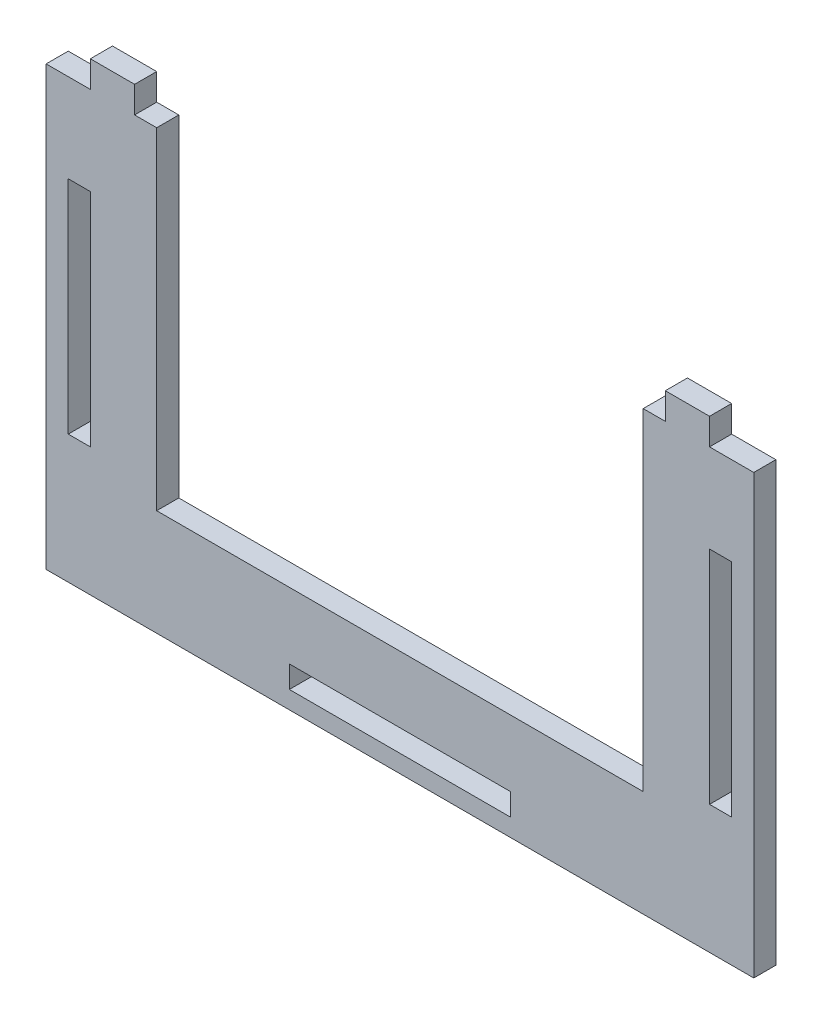
ISO-10303-21;
HEADER;
FILE_DESCRIPTION(('STEP AP214'),'2;1');
FILE_NAME('part.step','',(''),(''),'','','');
FILE_SCHEMA(('AUTOMOTIVE_DESIGN { 1 0 10303 214 1 1 1 1 }'));
ENDSEC;
DATA;
#1=APPLICATION_CONTEXT('core data for automotive mechanical design processes');
#2=APPLICATION_PROTOCOL_DEFINITION('international standard','automotive_design',2000,#1);
#3=PRODUCT_CONTEXT('',#1,'mechanical');
#4=PRODUCT('Part','Part','',(#3));
#5=PRODUCT_RELATED_PRODUCT_CATEGORY('part','',(#4));
#6=PRODUCT_DEFINITION_FORMATION('','',#4);
#7=PRODUCT_DEFINITION_CONTEXT('part definition',#1,'design');
#8=PRODUCT_DEFINITION('design','',#6,#7);
#9=PRODUCT_DEFINITION_SHAPE('','',#8);
#10=(LENGTH_UNIT() NAMED_UNIT(*) SI_UNIT(.MILLI.,.METRE.));
#11=(NAMED_UNIT(*) PLANE_ANGLE_UNIT() SI_UNIT($,.RADIAN.));
#12=(NAMED_UNIT(*) SI_UNIT($,.STERADIAN.) SOLID_ANGLE_UNIT());
#13=UNCERTAINTY_MEASURE_WITH_UNIT(LENGTH_MEASURE(1.E-05),#10,'distance_accuracy_value','');
#14=(GEOMETRIC_REPRESENTATION_CONTEXT(3) GLOBAL_UNCERTAINTY_ASSIGNED_CONTEXT((#13)) GLOBAL_UNIT_ASSIGNED_CONTEXT((#10,
#11,#12)) REPRESENTATION_CONTEXT('',''));
#15=CARTESIAN_POINT('',(0.,0.,0.));
#16=DIRECTION('',(0.,0.,1.));
#17=DIRECTION('',(1.,0.,0.));
#18=AXIS2_PLACEMENT_3D('',#15,#16,#17);
#19=CARTESIAN_POINT('',(0.,0.,3.175));
#20=DIRECTION('',(0.,0.,1.));
#21=DIRECTION('',(1.,0.,0.));
#22=AXIS2_PLACEMENT_3D('',#19,#20,#21);
#23=PLANE('',#22);
#24=DIRECTION('',(1.,0.,0.));
#25=VECTOR('',#24,1.);
#26=CARTESIAN_POINT('',(-47.625,-15.875,3.175));
#27=LINE('',#26,#25);
#28=CARTESIAN_POINT('',(-47.625,-15.875,3.175));
#29=VERTEX_POINT('',#28);
#30=CARTESIAN_POINT('',(-44.45,-15.875,3.175));
#31=VERTEX_POINT('',#30);
#32=EDGE_CURVE('E257',#29,#31,#27,.T.);
#33=ORIENTED_EDGE('',*,*,#32,.F.);
#34=DIRECTION('',(0.,-1.,0.));
#35=VECTOR('',#34,1.);
#36=CARTESIAN_POINT('',(-47.625,15.875,3.175));
#37=LINE('',#36,#35);
#38=CARTESIAN_POINT('',(-47.625,15.875,3.175));
#39=VERTEX_POINT('',#38);
#40=EDGE_CURVE('E255',#39,#29,#37,.T.);
#41=ORIENTED_EDGE('',*,*,#40,.F.);
#42=DIRECTION('',(-1.,0.,0.));
#43=VECTOR('',#42,1.);
#44=CARTESIAN_POINT('',(-47.625,15.875,3.175));
#45=LINE('',#44,#43);
#46=CARTESIAN_POINT('',(-44.45,15.875,3.175));
#47=VERTEX_POINT('',#46);
#48=EDGE_CURVE('E263',#47,#39,#45,.T.);
#49=ORIENTED_EDGE('',*,*,#48,.F.);
#50=DIRECTION('',(0.,1.,0.));
#51=VECTOR('',#50,1.);
#52=CARTESIAN_POINT('',(-44.45,15.875,3.175));
#53=LINE('',#52,#51);
#54=EDGE_CURVE('E260',#31,#47,#53,.T.);
#55=ORIENTED_EDGE('',*,*,#54,.F.);
#56=EDGE_LOOP('',(#33,#41,#49,#55));
#57=FACE_BOUND('',#56,.T.);
#58=DIRECTION('',(0.,-1.,0.));
#59=VECTOR('',#58,1.);
#60=CARTESIAN_POINT('',(-50.8,28.575,3.175));
#61=LINE('',#60,#59);
#62=CARTESIAN_POINT('',(-50.8,28.575,3.175));
#63=VERTEX_POINT('',#62);
#64=CARTESIAN_POINT('',(-50.8,-34.29,3.175));
#65=VERTEX_POINT('',#64);
#66=EDGE_CURVE('E317',#63,#65,#61,.T.);
#67=ORIENTED_EDGE('',*,*,#66,.T.);
#68=DIRECTION('',(1.,0.,0.));
#69=VECTOR('',#68,1.);
#70=CARTESIAN_POINT('',(-50.8,-34.29,3.175));
#71=LINE('',#70,#69);
#72=CARTESIAN_POINT('',(50.8,-34.29,3.175));
#73=VERTEX_POINT('',#72);
#74=EDGE_CURVE('E320',#65,#73,#71,.T.);
#75=ORIENTED_EDGE('',*,*,#74,.T.);
#76=DIRECTION('',(0.,1.,0.));
#77=VECTOR('',#76,1.);
#78=CARTESIAN_POINT('',(50.8,28.575,3.175));
#79=LINE('',#78,#77);
#80=CARTESIAN_POINT('',(50.8,28.575,3.175));
#81=VERTEX_POINT('',#80);
#82=EDGE_CURVE('E323',#73,#81,#79,.T.);
#83=ORIENTED_EDGE('',*,*,#82,.T.);
#84=DIRECTION('',(-1.,0.,0.));
#85=VECTOR('',#84,1.);
#86=CARTESIAN_POINT('',(44.45,28.575,3.175));
#87=LINE('',#86,#85);
#88=CARTESIAN_POINT('',(44.45,28.575,3.175));
#89=VERTEX_POINT('',#88);
#90=EDGE_CURVE('E325',#81,#89,#87,.T.);
#91=ORIENTED_EDGE('',*,*,#90,.T.);
#92=DIRECTION('',(0.,1.,0.));
#93=VECTOR('',#92,1.);
#94=CARTESIAN_POINT('',(44.45,28.575,3.175));
#95=LINE('',#94,#93);
#96=CARTESIAN_POINT('',(44.45,32.385,3.175));
#97=VERTEX_POINT('',#96);
#98=EDGE_CURVE('E327',#89,#97,#95,.T.);
#99=ORIENTED_EDGE('',*,*,#98,.T.);
#100=DIRECTION('',(-1.,0.,0.));
#101=VECTOR('',#100,1.);
#102=CARTESIAN_POINT('',(44.45,32.385,3.175));
#103=LINE('',#102,#101);
#104=CARTESIAN_POINT('',(38.1,32.385,3.175));
#105=VERTEX_POINT('',#104);
#106=EDGE_CURVE('E329',#97,#105,#103,.T.);
#107=ORIENTED_EDGE('',*,*,#106,.T.);
#108=DIRECTION('',(0.,-1.,0.));
#109=VECTOR('',#108,1.);
#110=CARTESIAN_POINT('',(38.1,28.575,3.175));
#111=LINE('',#110,#109);
#112=CARTESIAN_POINT('',(38.1,28.575,3.175));
#113=VERTEX_POINT('',#112);
#114=EDGE_CURVE('E331',#105,#113,#111,.T.);
#115=ORIENTED_EDGE('',*,*,#114,.T.);
#116=DIRECTION('',(-1.,0.,0.));
#117=VECTOR('',#116,1.);
#118=CARTESIAN_POINT('',(34.925,28.575,3.175));
#119=LINE('',#118,#117);
#120=CARTESIAN_POINT('',(34.925,28.575,3.175));
#121=VERTEX_POINT('',#120);
#122=EDGE_CURVE('E333',#113,#121,#119,.T.);
#123=ORIENTED_EDGE('',*,*,#122,.T.);
#124=DIRECTION('',(0.,-1.,0.));
#125=VECTOR('',#124,1.);
#126=CARTESIAN_POINT('',(34.925,-19.05,3.175));
#127=LINE('',#126,#125);
#128=CARTESIAN_POINT('',(34.925,-19.05,3.175));
#129=VERTEX_POINT('',#128);
#130=EDGE_CURVE('E335',#121,#129,#127,.T.);
#131=ORIENTED_EDGE('',*,*,#130,.T.);
#132=DIRECTION('',(-1.,0.,0.));
#133=VECTOR('',#132,1.);
#134=CARTESIAN_POINT('',(-34.925,-19.05,3.175));
#135=LINE('',#134,#133);
#136=CARTESIAN_POINT('',(-34.925,-19.05,3.175));
#137=VERTEX_POINT('',#136);
#138=EDGE_CURVE('E337',#129,#137,#135,.T.);
#139=ORIENTED_EDGE('',*,*,#138,.T.);
#140=DIRECTION('',(0.,1.,0.));
#141=VECTOR('',#140,1.);
#142=CARTESIAN_POINT('',(-34.925,28.575,3.175));
#143=LINE('',#142,#141);
#144=CARTESIAN_POINT('',(-34.925,28.575,3.175));
#145=VERTEX_POINT('',#144);
#146=EDGE_CURVE('E339',#137,#145,#143,.T.);
#147=ORIENTED_EDGE('',*,*,#146,.T.);
#148=DIRECTION('',(-1.,0.,0.));
#149=VECTOR('',#148,1.);
#150=CARTESIAN_POINT('',(-38.1,28.575,3.175));
#151=LINE('',#150,#149);
#152=CARTESIAN_POINT('',(-38.1,28.575,3.175));
#153=VERTEX_POINT('',#152);
#154=EDGE_CURVE('E341',#145,#153,#151,.T.);
#155=ORIENTED_EDGE('',*,*,#154,.T.);
#156=DIRECTION('',(0.,1.,0.));
#157=VECTOR('',#156,1.);
#158=CARTESIAN_POINT('',(-38.1,28.575,3.175));
#159=LINE('',#158,#157);
#160=CARTESIAN_POINT('',(-38.1,32.385,3.175));
#161=VERTEX_POINT('',#160);
#162=EDGE_CURVE('E343',#153,#161,#159,.T.);
#163=ORIENTED_EDGE('',*,*,#162,.T.);
#164=DIRECTION('',(-1.,0.,0.));
#165=VECTOR('',#164,1.);
#166=CARTESIAN_POINT('',(-44.45,32.385,3.175));
#167=LINE('',#166,#165);
#168=CARTESIAN_POINT('',(-44.45,32.385,3.175));
#169=VERTEX_POINT('',#168);
#170=EDGE_CURVE('E345',#161,#169,#167,.T.);
#171=ORIENTED_EDGE('',*,*,#170,.T.);
#172=DIRECTION('',(0.,-1.,0.));
#173=VECTOR('',#172,1.);
#174=CARTESIAN_POINT('',(-44.45,28.575,3.175));
#175=LINE('',#174,#173);
#176=CARTESIAN_POINT('',(-44.45,28.575,3.175));
#177=VERTEX_POINT('',#176);
#178=EDGE_CURVE('E347',#169,#177,#175,.T.);
#179=ORIENTED_EDGE('',*,*,#178,.T.);
#180=DIRECTION('',(-1.,0.,0.));
#181=VECTOR('',#180,1.);
#182=CARTESIAN_POINT('',(-50.8,28.575,3.175));
#183=LINE('',#182,#181);
#184=EDGE_CURVE('E349',#177,#63,#183,.T.);
#185=ORIENTED_EDGE('',*,*,#184,.T.);
#186=EDGE_LOOP('',(#67,#75,#83,#91,#99,#107,#115,#123,#131,#139,#147,#155,#163,#171,#179,#185));
#187=FACE_BOUND('',#186,.T.);
#188=DIRECTION('',(1.,0.,0.));
#189=VECTOR('',#188,1.);
#190=CARTESIAN_POINT('',(-15.875,-31.75,3.175));
#191=LINE('',#190,#189);
#192=CARTESIAN_POINT('',(-15.875,-31.75,3.175));
#193=VERTEX_POINT('',#192);
#194=CARTESIAN_POINT('',(15.875,-31.75,3.175));
#195=VERTEX_POINT('',#194);
#196=EDGE_CURVE('E288',#193,#195,#191,.T.);
#197=ORIENTED_EDGE('',*,*,#196,.F.);
#198=DIRECTION('',(0.,-1.,0.));
#199=VECTOR('',#198,1.);
#200=CARTESIAN_POINT('',(-15.875,-28.575,3.175));
#201=LINE('',#200,#199);
#202=CARTESIAN_POINT('',(-15.875,-28.575,3.175));
#203=VERTEX_POINT('',#202);
#204=EDGE_CURVE('E286',#203,#193,#201,.T.);
#205=ORIENTED_EDGE('',*,*,#204,.F.);
#206=DIRECTION('',(-1.,0.,0.));
#207=VECTOR('',#206,1.);
#208=CARTESIAN_POINT('',(-15.875,-28.575,3.175));
#209=LINE('',#208,#207);
#210=CARTESIAN_POINT('',(15.875,-28.575,3.175));
#211=VERTEX_POINT('',#210);
#212=EDGE_CURVE('E294',#211,#203,#209,.T.);
#213=ORIENTED_EDGE('',*,*,#212,.F.);
#214=DIRECTION('',(0.,1.,0.));
#215=VECTOR('',#214,1.);
#216=CARTESIAN_POINT('',(15.875,-28.575,3.175));
#217=LINE('',#216,#215);
#218=EDGE_CURVE('E291',#195,#211,#217,.T.);
#219=ORIENTED_EDGE('',*,*,#218,.F.);
#220=EDGE_LOOP('',(#197,#205,#213,#219));
#221=FACE_BOUND('',#220,.T.);
#222=DIRECTION('',(1.,0.,0.));
#223=VECTOR('',#222,1.);
#224=CARTESIAN_POINT('',(44.45,-15.875,3.175));
#225=LINE('',#224,#223);
#226=CARTESIAN_POINT('',(44.45,-15.875,3.175));
#227=VERTEX_POINT('',#226);
#228=CARTESIAN_POINT('',(47.625,-15.875,3.175));
#229=VERTEX_POINT('',#228);
#230=EDGE_CURVE('E227',#227,#229,#225,.T.);
#231=ORIENTED_EDGE('',*,*,#230,.F.);
#232=DIRECTION('',(0.,-1.,0.));
#233=VECTOR('',#232,1.);
#234=CARTESIAN_POINT('',(44.45,15.875,3.175));
#235=LINE('',#234,#233);
#236=CARTESIAN_POINT('',(44.45,15.875,3.175));
#237=VERTEX_POINT('',#236);
#238=EDGE_CURVE('E219',#237,#227,#235,.T.);
#239=ORIENTED_EDGE('',*,*,#238,.F.);
#240=DIRECTION('',(-1.,0.,0.));
#241=VECTOR('',#240,1.);
#242=CARTESIAN_POINT('',(44.45,15.875,3.175));
#243=LINE('',#242,#241);
#244=CARTESIAN_POINT('',(47.625,15.875,3.175));
#245=VERTEX_POINT('',#244);
#246=EDGE_CURVE('E241',#245,#237,#243,.T.);
#247=ORIENTED_EDGE('',*,*,#246,.F.);
#248=DIRECTION('',(0.,1.,0.));
#249=VECTOR('',#248,1.);
#250=CARTESIAN_POINT('',(47.625,15.875,3.175));
#251=LINE('',#250,#249);
#252=EDGE_CURVE('E239',#229,#245,#251,.T.);
#253=ORIENTED_EDGE('',*,*,#252,.F.);
#254=EDGE_LOOP('',(#231,#239,#247,#253));
#255=FACE_BOUND('',#254,.T.);
#256=ADVANCED_FACE('F34',(#57,#187,#221,#255),#23,.T.);
#257=CARTESIAN_POINT('',(0.,0.,0.));
#258=DIRECTION('',(0.,0.,1.));
#259=DIRECTION('',(1.,0.,0.));
#260=AXIS2_PLACEMENT_3D('',#257,#258,#259);
#261=PLANE('',#260);
#262=DIRECTION('',(0.,-1.,0.));
#263=VECTOR('',#262,1.);
#264=CARTESIAN_POINT('',(-47.625,15.875,0.));
#265=LINE('',#264,#263);
#266=CARTESIAN_POINT('',(-47.625,15.875,0.));
#267=VERTEX_POINT('',#266);
#268=CARTESIAN_POINT('',(-47.625,-15.875,0.));
#269=VERTEX_POINT('',#268);
#270=EDGE_CURVE('E235',#267,#269,#265,.T.);
#271=ORIENTED_EDGE('',*,*,#270,.T.);
#272=DIRECTION('',(1.,0.,0.));
#273=VECTOR('',#272,1.);
#274=CARTESIAN_POINT('',(-47.625,-15.875,0.));
#275=LINE('',#274,#273);
#276=CARTESIAN_POINT('',(-44.45,-15.875,0.));
#277=VERTEX_POINT('',#276);
#278=EDGE_CURVE('E268',#269,#277,#275,.T.);
#279=ORIENTED_EDGE('',*,*,#278,.T.);
#280=DIRECTION('',(0.,1.,0.));
#281=VECTOR('',#280,1.);
#282=CARTESIAN_POINT('',(-44.45,15.875,0.));
#283=LINE('',#282,#281);
#284=CARTESIAN_POINT('',(-44.45,15.875,0.));
#285=VERTEX_POINT('',#284);
#286=EDGE_CURVE('E271',#277,#285,#283,.T.);
#287=ORIENTED_EDGE('',*,*,#286,.T.);
#288=DIRECTION('',(-1.,0.,0.));
#289=VECTOR('',#288,1.);
#290=CARTESIAN_POINT('',(-47.625,15.875,0.));
#291=LINE('',#290,#289);
#292=EDGE_CURVE('E258',#285,#267,#291,.T.);
#293=ORIENTED_EDGE('',*,*,#292,.T.);
#294=EDGE_LOOP('',(#271,#279,#287,#293));
#295=FACE_BOUND('',#294,.T.);
#296=DIRECTION('',(0.,-1.,0.));
#297=VECTOR('',#296,1.);
#298=CARTESIAN_POINT('',(-50.8,28.575,0.));
#299=LINE('',#298,#297);
#300=CARTESIAN_POINT('',(-50.8,28.575,0.));
#301=VERTEX_POINT('',#300);
#302=CARTESIAN_POINT('',(-50.8,-34.29,0.));
#303=VERTEX_POINT('',#302);
#304=EDGE_CURVE('E316',#301,#303,#299,.T.);
#305=ORIENTED_EDGE('',*,*,#304,.F.);
#306=DIRECTION('',(-1.,0.,0.));
#307=VECTOR('',#306,1.);
#308=CARTESIAN_POINT('',(-50.8,28.575,0.));
#309=LINE('',#308,#307);
#310=CARTESIAN_POINT('',(-44.45,28.575,0.));
#311=VERTEX_POINT('',#310);
#312=EDGE_CURVE('E321',#311,#301,#309,.T.);
#313=ORIENTED_EDGE('',*,*,#312,.F.);
#314=DIRECTION('',(0.,-1.,0.));
#315=VECTOR('',#314,1.);
#316=CARTESIAN_POINT('',(-44.45,28.575,0.));
#317=LINE('',#316,#315);
#318=CARTESIAN_POINT('',(-44.45,32.385,0.));
#319=VERTEX_POINT('',#318);
#320=EDGE_CURVE('E380',#319,#311,#317,.T.);
#321=ORIENTED_EDGE('',*,*,#320,.F.);
#322=DIRECTION('',(-1.,0.,0.));
#323=VECTOR('',#322,1.);
#324=CARTESIAN_POINT('',(-44.45,32.385,0.));
#325=LINE('',#324,#323);
#326=CARTESIAN_POINT('',(-38.1,32.385,0.));
#327=VERTEX_POINT('',#326);
#328=EDGE_CURVE('E378',#327,#319,#325,.T.);
#329=ORIENTED_EDGE('',*,*,#328,.F.);
#330=DIRECTION('',(0.,1.,0.));
#331=VECTOR('',#330,1.);
#332=CARTESIAN_POINT('',(-38.1,28.575,0.));
#333=LINE('',#332,#331);
#334=CARTESIAN_POINT('',(-38.1,28.575,0.));
#335=VERTEX_POINT('',#334);
#336=EDGE_CURVE('E376',#335,#327,#333,.T.);
#337=ORIENTED_EDGE('',*,*,#336,.F.);
#338=DIRECTION('',(-1.,0.,0.));
#339=VECTOR('',#338,1.);
#340=CARTESIAN_POINT('',(-38.1,28.575,0.));
#341=LINE('',#340,#339);
#342=CARTESIAN_POINT('',(-34.925,28.575,0.));
#343=VERTEX_POINT('',#342);
#344=EDGE_CURVE('E374',#343,#335,#341,.T.);
#345=ORIENTED_EDGE('',*,*,#344,.F.);
#346=DIRECTION('',(0.,1.,0.));
#347=VECTOR('',#346,1.);
#348=CARTESIAN_POINT('',(-34.925,28.575,0.));
#349=LINE('',#348,#347);
#350=CARTESIAN_POINT('',(-34.925,-19.05,0.));
#351=VERTEX_POINT('',#350);
#352=EDGE_CURVE('E372',#351,#343,#349,.T.);
#353=ORIENTED_EDGE('',*,*,#352,.F.);
#354=DIRECTION('',(-1.,0.,0.));
#355=VECTOR('',#354,1.);
#356=CARTESIAN_POINT('',(-34.925,-19.05,0.));
#357=LINE('',#356,#355);
#358=CARTESIAN_POINT('',(34.925,-19.05,0.));
#359=VERTEX_POINT('',#358);
#360=EDGE_CURVE('E370',#359,#351,#357,.T.);
#361=ORIENTED_EDGE('',*,*,#360,.F.);
#362=DIRECTION('',(0.,-1.,0.));
#363=VECTOR('',#362,1.);
#364=CARTESIAN_POINT('',(34.925,-19.05,0.));
#365=LINE('',#364,#363);
#366=CARTESIAN_POINT('',(34.925,28.575,0.));
#367=VERTEX_POINT('',#366);
#368=EDGE_CURVE('E368',#367,#359,#365,.T.);
#369=ORIENTED_EDGE('',*,*,#368,.F.);
#370=DIRECTION('',(-1.,0.,0.));
#371=VECTOR('',#370,1.);
#372=CARTESIAN_POINT('',(34.925,28.575,0.));
#373=LINE('',#372,#371);
#374=CARTESIAN_POINT('',(38.1,28.575,0.));
#375=VERTEX_POINT('',#374);
#376=EDGE_CURVE('E366',#375,#367,#373,.T.);
#377=ORIENTED_EDGE('',*,*,#376,.F.);
#378=DIRECTION('',(0.,-1.,0.));
#379=VECTOR('',#378,1.);
#380=CARTESIAN_POINT('',(38.1,28.575,0.));
#381=LINE('',#380,#379);
#382=CARTESIAN_POINT('',(38.1,32.385,0.));
#383=VERTEX_POINT('',#382);
#384=EDGE_CURVE('E364',#383,#375,#381,.T.);
#385=ORIENTED_EDGE('',*,*,#384,.F.);
#386=DIRECTION('',(-1.,0.,0.));
#387=VECTOR('',#386,1.);
#388=CARTESIAN_POINT('',(44.45,32.385,0.));
#389=LINE('',#388,#387);
#390=CARTESIAN_POINT('',(44.45,32.385,0.));
#391=VERTEX_POINT('',#390);
#392=EDGE_CURVE('E362',#391,#383,#389,.T.);
#393=ORIENTED_EDGE('',*,*,#392,.F.);
#394=DIRECTION('',(0.,1.,0.));
#395=VECTOR('',#394,1.);
#396=CARTESIAN_POINT('',(44.45,28.575,0.));
#397=LINE('',#396,#395);
#398=CARTESIAN_POINT('',(44.45,28.575,0.));
#399=VERTEX_POINT('',#398);
#400=EDGE_CURVE('E360',#399,#391,#397,.T.);
#401=ORIENTED_EDGE('',*,*,#400,.F.);
#402=DIRECTION('',(-1.,0.,0.));
#403=VECTOR('',#402,1.);
#404=CARTESIAN_POINT('',(44.45,28.575,0.));
#405=LINE('',#404,#403);
#406=CARTESIAN_POINT('',(50.8,28.575,0.));
#407=VERTEX_POINT('',#406);
#408=EDGE_CURVE('E358',#407,#399,#405,.T.);
#409=ORIENTED_EDGE('',*,*,#408,.F.);
#410=DIRECTION('',(0.,1.,0.));
#411=VECTOR('',#410,1.);
#412=CARTESIAN_POINT('',(50.8,28.575,0.));
#413=LINE('',#412,#411);
#414=CARTESIAN_POINT('',(50.8,-34.29,0.));
#415=VERTEX_POINT('',#414);
#416=EDGE_CURVE('E356',#415,#407,#413,.T.);
#417=ORIENTED_EDGE('',*,*,#416,.F.);
#418=DIRECTION('',(1.,0.,0.));
#419=VECTOR('',#418,1.);
#420=CARTESIAN_POINT('',(-50.8,-34.29,0.));
#421=LINE('',#420,#419);
#422=EDGE_CURVE('E354',#303,#415,#421,.T.);
#423=ORIENTED_EDGE('',*,*,#422,.F.);
#424=EDGE_LOOP('',(#305,#313,#321,#329,#337,#345,#353,#361,#369,#377,#385,#393,#401,#409,#417,#423));
#425=FACE_BOUND('',#424,.T.);
#426=DIRECTION('',(0.,-1.,0.));
#427=VECTOR('',#426,1.);
#428=CARTESIAN_POINT('',(-15.875,-28.575,0.));
#429=LINE('',#428,#427);
#430=CARTESIAN_POINT('',(-15.875,-28.575,0.));
#431=VERTEX_POINT('',#430);
#432=CARTESIAN_POINT('',(-15.875,-31.75,0.));
#433=VERTEX_POINT('',#432);
#434=EDGE_CURVE('E285',#431,#433,#429,.T.);
#435=ORIENTED_EDGE('',*,*,#434,.T.);
#436=DIRECTION('',(1.,0.,0.));
#437=VECTOR('',#436,1.);
#438=CARTESIAN_POINT('',(-15.875,-31.75,0.));
#439=LINE('',#438,#437);
#440=CARTESIAN_POINT('',(15.875,-31.75,0.));
#441=VERTEX_POINT('',#440);
#442=EDGE_CURVE('E299',#433,#441,#439,.T.);
#443=ORIENTED_EDGE('',*,*,#442,.T.);
#444=DIRECTION('',(0.,1.,0.));
#445=VECTOR('',#444,1.);
#446=CARTESIAN_POINT('',(15.875,-28.575,0.));
#447=LINE('',#446,#445);
#448=CARTESIAN_POINT('',(15.875,-28.575,0.));
#449=VERTEX_POINT('',#448);
#450=EDGE_CURVE('E302',#441,#449,#447,.T.);
#451=ORIENTED_EDGE('',*,*,#450,.T.);
#452=DIRECTION('',(-1.,0.,0.));
#453=VECTOR('',#452,1.);
#454=CARTESIAN_POINT('',(-15.875,-28.575,0.));
#455=LINE('',#454,#453);
#456=EDGE_CURVE('E289',#449,#431,#455,.T.);
#457=ORIENTED_EDGE('',*,*,#456,.T.);
#458=EDGE_LOOP('',(#435,#443,#451,#457));
#459=FACE_BOUND('',#458,.T.);
#460=DIRECTION('',(0.,-1.,0.));
#461=VECTOR('',#460,1.);
#462=CARTESIAN_POINT('',(44.45,15.875,0.));
#463=LINE('',#462,#461);
#464=CARTESIAN_POINT('',(44.45,15.875,0.));
#465=VERTEX_POINT('',#464);
#466=CARTESIAN_POINT('',(44.45,-15.875,0.));
#467=VERTEX_POINT('',#466);
#468=EDGE_CURVE('E57',#465,#467,#463,.T.);
#469=ORIENTED_EDGE('',*,*,#468,.T.);
#470=DIRECTION('',(1.,0.,0.));
#471=VECTOR('',#470,1.);
#472=CARTESIAN_POINT('',(44.45,-15.875,0.));
#473=LINE('',#472,#471);
#474=CARTESIAN_POINT('',(47.625,-15.875,0.));
#475=VERTEX_POINT('',#474);
#476=EDGE_CURVE('E234',#467,#475,#473,.T.);
#477=ORIENTED_EDGE('',*,*,#476,.T.);
#478=DIRECTION('',(0.,1.,0.));
#479=VECTOR('',#478,1.);
#480=CARTESIAN_POINT('',(47.625,15.875,0.));
#481=LINE('',#480,#479);
#482=CARTESIAN_POINT('',(47.625,15.875,0.));
#483=VERTEX_POINT('',#482);
#484=EDGE_CURVE('E247',#475,#483,#481,.T.);
#485=ORIENTED_EDGE('',*,*,#484,.T.);
#486=DIRECTION('',(-1.,0.,0.));
#487=VECTOR('',#486,1.);
#488=CARTESIAN_POINT('',(44.45,15.875,0.));
#489=LINE('',#488,#487);
#490=EDGE_CURVE('E228',#483,#465,#489,.T.);
#491=ORIENTED_EDGE('',*,*,#490,.T.);
#492=EDGE_LOOP('',(#469,#477,#485,#491));
#493=FACE_BOUND('',#492,.T.);
#494=ADVANCED_FACE('F434',(#295,#425,#459,#493),#261,.F.);
#495=CARTESIAN_POINT('',(-50.8,28.575,3.175));
#496=DIRECTION('',(1.,0.,0.));
#497=DIRECTION('',(0.,1.,0.));
#498=AXIS2_PLACEMENT_3D('',#495,#496,#497);
#499=PLANE('',#498);
#500=ORIENTED_EDGE('',*,*,#304,.T.);
#501=DIRECTION('',(0.,0.,-1.));
#502=VECTOR('',#501,1.);
#503=CARTESIAN_POINT('',(-50.8,-34.29,3.175));
#504=LINE('',#503,#502);
#505=EDGE_CURVE('E11',#65,#303,#504,.T.);
#506=ORIENTED_EDGE('',*,*,#505,.F.);
#507=ORIENTED_EDGE('',*,*,#66,.F.);
#508=DIRECTION('',(0.,0.,-1.));
#509=VECTOR('',#508,1.);
#510=CARTESIAN_POINT('',(-50.8,28.575,3.175));
#511=LINE('',#510,#509);
#512=EDGE_CURVE('E351',#63,#301,#511,.T.);
#513=ORIENTED_EDGE('',*,*,#512,.T.);
#514=EDGE_LOOP('',(#500,#506,#507,#513));
#515=FACE_BOUND('',#514,.T.);
#516=ADVANCED_FACE('F36',(#515),#499,.F.);
#517=CARTESIAN_POINT('',(-50.8,-34.29,3.175));
#518=DIRECTION('',(0.,1.,0.));
#519=DIRECTION('',(0.,0.,1.));
#520=AXIS2_PLACEMENT_3D('',#517,#518,#519);
#521=PLANE('',#520);
#522=ORIENTED_EDGE('',*,*,#422,.T.);
#523=DIRECTION('',(0.,0.,-1.));
#524=VECTOR('',#523,1.);
#525=CARTESIAN_POINT('',(50.8,-34.29,3.175));
#526=LINE('',#525,#524);
#527=EDGE_CURVE('E42',#73,#415,#526,.T.);
#528=ORIENTED_EDGE('',*,*,#527,.F.);
#529=ORIENTED_EDGE('',*,*,#74,.F.);
#530=ORIENTED_EDGE('',*,*,#505,.T.);
#531=EDGE_LOOP('',(#522,#528,#529,#530));
#532=FACE_BOUND('',#531,.T.);
#533=ADVANCED_FACE('F452',(#532),#521,.F.);
#534=CARTESIAN_POINT('',(50.8,28.575,3.175));
#535=DIRECTION('',(-1.,0.,0.));
#536=DIRECTION('',(0.,0.,1.));
#537=AXIS2_PLACEMENT_3D('',#534,#535,#536);
#538=PLANE('',#537);
#539=ORIENTED_EDGE('',*,*,#416,.T.);
#540=DIRECTION('',(0.,0.,-1.));
#541=VECTOR('',#540,1.);
#542=CARTESIAN_POINT('',(50.8,28.575,3.175));
#543=LINE('',#542,#541);
#544=EDGE_CURVE('E421',#81,#407,#543,.T.);
#545=ORIENTED_EDGE('',*,*,#544,.F.);
#546=ORIENTED_EDGE('',*,*,#82,.F.);
#547=ORIENTED_EDGE('',*,*,#527,.T.);
#548=EDGE_LOOP('',(#539,#545,#546,#547));
#549=FACE_BOUND('',#548,.T.);
#550=ADVANCED_FACE('F428',(#549),#538,.F.);
#551=CARTESIAN_POINT('',(44.45,28.575,3.175));
#552=DIRECTION('',(0.,-1.,0.));
#553=DIRECTION('',(0.,0.,-1.));
#554=AXIS2_PLACEMENT_3D('',#551,#552,#553);
#555=PLANE('',#554);
#556=ORIENTED_EDGE('',*,*,#408,.T.);
#557=DIRECTION('',(0.,0.,-1.));
#558=VECTOR('',#557,1.);
#559=CARTESIAN_POINT('',(44.45,28.575,3.175));
#560=LINE('',#559,#558);
#561=EDGE_CURVE('E418',#89,#399,#560,.T.);
#562=ORIENTED_EDGE('',*,*,#561,.F.);
#563=ORIENTED_EDGE('',*,*,#90,.F.);
#564=ORIENTED_EDGE('',*,*,#544,.T.);
#565=EDGE_LOOP('',(#556,#562,#563,#564));
#566=FACE_BOUND('',#565,.T.);
#567=ADVANCED_FACE('F440',(#566),#555,.F.);
#568=CARTESIAN_POINT('',(44.45,28.575,3.175));
#569=DIRECTION('',(-1.,0.,0.));
#570=DIRECTION('',(0.,0.,1.));
#571=AXIS2_PLACEMENT_3D('',#568,#569,#570);
#572=PLANE('',#571);
#573=ORIENTED_EDGE('',*,*,#400,.T.);
#574=DIRECTION('',(0.,0.,-1.));
#575=VECTOR('',#574,1.);
#576=CARTESIAN_POINT('',(44.45,32.385,3.175));
#577=LINE('',#576,#575);
#578=EDGE_CURVE('E415',#97,#391,#577,.T.);
#579=ORIENTED_EDGE('',*,*,#578,.F.);
#580=ORIENTED_EDGE('',*,*,#98,.F.);
#581=ORIENTED_EDGE('',*,*,#561,.T.);
#582=EDGE_LOOP('',(#573,#579,#580,#581));
#583=FACE_BOUND('',#582,.T.);
#584=ADVANCED_FACE('F444',(#583),#572,.F.);
#585=CARTESIAN_POINT('',(44.45,32.385,3.175));
#586=DIRECTION('',(0.,-1.,0.));
#587=DIRECTION('',(0.,0.,-1.));
#588=AXIS2_PLACEMENT_3D('',#585,#586,#587);
#589=PLANE('',#588);
#590=ORIENTED_EDGE('',*,*,#392,.T.);
#591=DIRECTION('',(0.,0.,-1.));
#592=VECTOR('',#591,1.);
#593=CARTESIAN_POINT('',(38.1,32.385,3.175));
#594=LINE('',#593,#592);
#595=EDGE_CURVE('E412',#105,#383,#594,.T.);
#596=ORIENTED_EDGE('',*,*,#595,.F.);
#597=ORIENTED_EDGE('',*,*,#106,.F.);
#598=ORIENTED_EDGE('',*,*,#578,.T.);
#599=EDGE_LOOP('',(#590,#596,#597,#598));
#600=FACE_BOUND('',#599,.T.);
#601=ADVANCED_FACE('F505',(#600),#589,.F.);
#602=CARTESIAN_POINT('',(38.1,28.575,3.175));
#603=DIRECTION('',(1.,0.,0.));
#604=DIRECTION('',(0.,0.,-1.));
#605=AXIS2_PLACEMENT_3D('',#602,#603,#604);
#606=PLANE('',#605);
#607=ORIENTED_EDGE('',*,*,#384,.T.);
#608=DIRECTION('',(0.,0.,-1.));
#609=VECTOR('',#608,1.);
#610=CARTESIAN_POINT('',(38.1,28.575,3.175));
#611=LINE('',#610,#609);
#612=EDGE_CURVE('E409',#113,#375,#611,.T.);
#613=ORIENTED_EDGE('',*,*,#612,.F.);
#614=ORIENTED_EDGE('',*,*,#114,.F.);
#615=ORIENTED_EDGE('',*,*,#595,.T.);
#616=EDGE_LOOP('',(#607,#613,#614,#615));
#617=FACE_BOUND('',#616,.T.);
#618=ADVANCED_FACE('F502',(#617),#606,.F.);
#619=CARTESIAN_POINT('',(34.925,28.575,3.175));
#620=DIRECTION('',(0.,-1.,0.));
#621=DIRECTION('',(0.,0.,-1.));
#622=AXIS2_PLACEMENT_3D('',#619,#620,#621);
#623=PLANE('',#622);
#624=ORIENTED_EDGE('',*,*,#376,.T.);
#625=DIRECTION('',(0.,0.,-1.));
#626=VECTOR('',#625,1.);
#627=CARTESIAN_POINT('',(34.925,28.575,3.175));
#628=LINE('',#627,#626);
#629=EDGE_CURVE('E406',#121,#367,#628,.T.);
#630=ORIENTED_EDGE('',*,*,#629,.F.);
#631=ORIENTED_EDGE('',*,*,#122,.F.);
#632=ORIENTED_EDGE('',*,*,#612,.T.);
#633=EDGE_LOOP('',(#624,#630,#631,#632));
#634=FACE_BOUND('',#633,.T.);
#635=ADVANCED_FACE('F498',(#634),#623,.F.);
#636=CARTESIAN_POINT('',(34.925,-19.05,3.175));
#637=DIRECTION('',(1.,0.,0.));
#638=DIRECTION('',(0.,0.,-1.));
#639=AXIS2_PLACEMENT_3D('',#636,#637,#638);
#640=PLANE('',#639);
#641=ORIENTED_EDGE('',*,*,#368,.T.);
#642=DIRECTION('',(0.,0.,-1.));
#643=VECTOR('',#642,1.);
#644=CARTESIAN_POINT('',(34.925,-19.05,3.175));
#645=LINE('',#644,#643);
#646=EDGE_CURVE('E403',#129,#359,#645,.T.);
#647=ORIENTED_EDGE('',*,*,#646,.F.);
#648=ORIENTED_EDGE('',*,*,#130,.F.);
#649=ORIENTED_EDGE('',*,*,#629,.T.);
#650=EDGE_LOOP('',(#641,#647,#648,#649));
#651=FACE_BOUND('',#650,.T.);
#652=ADVANCED_FACE('F494',(#651),#640,.F.);
#653=CARTESIAN_POINT('',(-34.925,-19.05,3.175));
#654=DIRECTION('',(0.,-1.,0.));
#655=DIRECTION('',(0.,0.,-1.));
#656=AXIS2_PLACEMENT_3D('',#653,#654,#655);
#657=PLANE('',#656);
#658=ORIENTED_EDGE('',*,*,#360,.T.);
#659=DIRECTION('',(0.,0.,-1.));
#660=VECTOR('',#659,1.);
#661=CARTESIAN_POINT('',(-34.925,-19.05,3.175));
#662=LINE('',#661,#660);
#663=EDGE_CURVE('E400',#137,#351,#662,.T.);
#664=ORIENTED_EDGE('',*,*,#663,.F.);
#665=ORIENTED_EDGE('',*,*,#138,.F.);
#666=ORIENTED_EDGE('',*,*,#646,.T.);
#667=EDGE_LOOP('',(#658,#664,#665,#666));
#668=FACE_BOUND('',#667,.T.);
#669=ADVANCED_FACE('F489',(#668),#657,.F.);
#670=CARTESIAN_POINT('',(-34.925,28.575,3.175));
#671=DIRECTION('',(-1.,0.,0.));
#672=DIRECTION('',(0.,0.,1.));
#673=AXIS2_PLACEMENT_3D('',#670,#671,#672);
#674=PLANE('',#673);
#675=ORIENTED_EDGE('',*,*,#352,.T.);
#676=DIRECTION('',(0.,0.,-1.));
#677=VECTOR('',#676,1.);
#678=CARTESIAN_POINT('',(-34.925,28.575,3.175));
#679=LINE('',#678,#677);
#680=EDGE_CURVE('E397',#145,#343,#679,.T.);
#681=ORIENTED_EDGE('',*,*,#680,.F.);
#682=ORIENTED_EDGE('',*,*,#146,.F.);
#683=ORIENTED_EDGE('',*,*,#663,.T.);
#684=EDGE_LOOP('',(#675,#681,#682,#683));
#685=FACE_BOUND('',#684,.T.);
#686=ADVANCED_FACE('F483',(#685),#674,.F.);
#687=CARTESIAN_POINT('',(-38.1,28.575,3.175));
#688=DIRECTION('',(0.,-1.,0.));
#689=DIRECTION('',(0.,0.,-1.));
#690=AXIS2_PLACEMENT_3D('',#687,#688,#689);
#691=PLANE('',#690);
#692=ORIENTED_EDGE('',*,*,#344,.T.);
#693=DIRECTION('',(0.,0.,-1.));
#694=VECTOR('',#693,1.);
#695=CARTESIAN_POINT('',(-38.1,28.575,3.175));
#696=LINE('',#695,#694);
#697=EDGE_CURVE('E394',#153,#335,#696,.T.);
#698=ORIENTED_EDGE('',*,*,#697,.F.);
#699=ORIENTED_EDGE('',*,*,#154,.F.);
#700=ORIENTED_EDGE('',*,*,#680,.T.);
#701=EDGE_LOOP('',(#692,#698,#699,#700));
#702=FACE_BOUND('',#701,.T.);
#703=ADVANCED_FACE('F479',(#702),#691,.F.);
#704=CARTESIAN_POINT('',(-38.1,28.575,3.175));
#705=DIRECTION('',(-1.,0.,0.));
#706=DIRECTION('',(0.,0.,1.));
#707=AXIS2_PLACEMENT_3D('',#704,#705,#706);
#708=PLANE('',#707);
#709=ORIENTED_EDGE('',*,*,#336,.T.);
#710=DIRECTION('',(0.,0.,-1.));
#711=VECTOR('',#710,1.);
#712=CARTESIAN_POINT('',(-38.1,32.385,3.175));
#713=LINE('',#712,#711);
#714=EDGE_CURVE('E391',#161,#327,#713,.T.);
#715=ORIENTED_EDGE('',*,*,#714,.F.);
#716=ORIENTED_EDGE('',*,*,#162,.F.);
#717=ORIENTED_EDGE('',*,*,#697,.T.);
#718=EDGE_LOOP('',(#709,#715,#716,#717));
#719=FACE_BOUND('',#718,.T.);
#720=ADVANCED_FACE('F474',(#719),#708,.F.);
#721=CARTESIAN_POINT('',(-44.45,32.385,3.175));
#722=DIRECTION('',(0.,-1.,0.));
#723=DIRECTION('',(0.,0.,-1.));
#724=AXIS2_PLACEMENT_3D('',#721,#722,#723);
#725=PLANE('',#724);
#726=ORIENTED_EDGE('',*,*,#328,.T.);
#727=DIRECTION('',(0.,0.,-1.));
#728=VECTOR('',#727,1.);
#729=CARTESIAN_POINT('',(-44.45,32.385,3.175));
#730=LINE('',#729,#728);
#731=EDGE_CURVE('E388',#169,#319,#730,.T.);
#732=ORIENTED_EDGE('',*,*,#731,.F.);
#733=ORIENTED_EDGE('',*,*,#170,.F.);
#734=ORIENTED_EDGE('',*,*,#714,.T.);
#735=EDGE_LOOP('',(#726,#732,#733,#734));
#736=FACE_BOUND('',#735,.T.);
#737=ADVANCED_FACE('F468',(#736),#725,.F.);
#738=CARTESIAN_POINT('',(-44.45,28.575,3.175));
#739=DIRECTION('',(1.,0.,0.));
#740=DIRECTION('',(0.,0.,-1.));
#741=AXIS2_PLACEMENT_3D('',#738,#739,#740);
#742=PLANE('',#741);
#743=ORIENTED_EDGE('',*,*,#320,.T.);
#744=DIRECTION('',(0.,0.,-1.));
#745=VECTOR('',#744,1.);
#746=CARTESIAN_POINT('',(-44.45,28.575,3.175));
#747=LINE('',#746,#745);
#748=EDGE_CURVE('E385',#177,#311,#747,.T.);
#749=ORIENTED_EDGE('',*,*,#748,.F.);
#750=ORIENTED_EDGE('',*,*,#178,.F.);
#751=ORIENTED_EDGE('',*,*,#731,.T.);
#752=EDGE_LOOP('',(#743,#749,#750,#751));
#753=FACE_BOUND('',#752,.T.);
#754=ADVANCED_FACE('F464',(#753),#742,.F.);
#755=CARTESIAN_POINT('',(-50.8,28.575,3.175));
#756=DIRECTION('',(0.,-1.,0.));
#757=DIRECTION('',(0.,0.,-1.));
#758=AXIS2_PLACEMENT_3D('',#755,#756,#757);
#759=PLANE('',#758);
#760=ORIENTED_EDGE('',*,*,#312,.T.);
#761=ORIENTED_EDGE('',*,*,#512,.F.);
#762=ORIENTED_EDGE('',*,*,#184,.F.);
#763=ORIENTED_EDGE('',*,*,#748,.T.);
#764=EDGE_LOOP('',(#760,#761,#762,#763));
#765=FACE_BOUND('',#764,.T.);
#766=ADVANCED_FACE('F459',(#765),#759,.F.);
#767=CARTESIAN_POINT('',(-15.875,-28.575,3.175));
#768=DIRECTION('',(1.,0.,0.));
#769=DIRECTION('',(0.,1.,0.));
#770=AXIS2_PLACEMENT_3D('',#767,#768,#769);
#771=PLANE('',#770);
#772=ORIENTED_EDGE('',*,*,#434,.F.);
#773=DIRECTION('',(0.,0.,-1.));
#774=VECTOR('',#773,1.);
#775=CARTESIAN_POINT('',(-15.875,-28.575,3.175));
#776=LINE('',#775,#774);
#777=EDGE_CURVE('E296',#203,#431,#776,.T.);
#778=ORIENTED_EDGE('',*,*,#777,.F.);
#779=ORIENTED_EDGE('',*,*,#204,.T.);
#780=DIRECTION('',(0.,0.,-1.));
#781=VECTOR('',#780,1.);
#782=CARTESIAN_POINT('',(-15.875,-31.75,3.175));
#783=LINE('',#782,#781);
#784=EDGE_CURVE('E313',#193,#433,#783,.T.);
#785=ORIENTED_EDGE('',*,*,#784,.T.);
#786=EDGE_LOOP('',(#772,#778,#779,#785));
#787=FACE_BOUND('',#786,.T.);
#788=ADVANCED_FACE('F524',(#787),#771,.T.);
#789=CARTESIAN_POINT('',(-15.875,-31.75,3.175));
#790=DIRECTION('',(0.,1.,0.));
#791=DIRECTION('',(0.,0.,1.));
#792=AXIS2_PLACEMENT_3D('',#789,#790,#791);
#793=PLANE('',#792);
#794=ORIENTED_EDGE('',*,*,#442,.F.);
#795=ORIENTED_EDGE('',*,*,#784,.F.);
#796=ORIENTED_EDGE('',*,*,#196,.T.);
#797=DIRECTION('',(0.,0.,-1.));
#798=VECTOR('',#797,1.);
#799=CARTESIAN_POINT('',(15.875,-31.75,3.175));
#800=LINE('',#799,#798);
#801=EDGE_CURVE('E311',#195,#441,#800,.T.);
#802=ORIENTED_EDGE('',*,*,#801,.T.);
#803=EDGE_LOOP('',(#794,#795,#796,#802));
#804=FACE_BOUND('',#803,.T.);
#805=ADVANCED_FACE('F586',(#804),#793,.T.);
#806=CARTESIAN_POINT('',(15.875,-28.575,3.175));
#807=DIRECTION('',(-1.,0.,0.));
#808=DIRECTION('',(0.,-1.,0.));
#809=AXIS2_PLACEMENT_3D('',#806,#807,#808);
#810=PLANE('',#809);
#811=ORIENTED_EDGE('',*,*,#450,.F.);
#812=ORIENTED_EDGE('',*,*,#801,.F.);
#813=ORIENTED_EDGE('',*,*,#218,.T.);
#814=DIRECTION('',(0.,0.,-1.));
#815=VECTOR('',#814,1.);
#816=CARTESIAN_POINT('',(15.875,-28.575,3.175));
#817=LINE('',#816,#815);
#818=EDGE_CURVE('E309',#211,#449,#817,.T.);
#819=ORIENTED_EDGE('',*,*,#818,.T.);
#820=EDGE_LOOP('',(#811,#812,#813,#819));
#821=FACE_BOUND('',#820,.T.);
#822=ADVANCED_FACE('F593',(#821),#810,.T.);
#823=CARTESIAN_POINT('',(-15.875,-28.575,3.175));
#824=DIRECTION('',(0.,-1.,0.));
#825=DIRECTION('',(1.,0.,0.));
#826=AXIS2_PLACEMENT_3D('',#823,#824,#825);
#827=PLANE('',#826);
#828=ORIENTED_EDGE('',*,*,#456,.F.);
#829=ORIENTED_EDGE('',*,*,#818,.F.);
#830=ORIENTED_EDGE('',*,*,#212,.T.);
#831=ORIENTED_EDGE('',*,*,#777,.T.);
#832=EDGE_LOOP('',(#828,#829,#830,#831));
#833=FACE_BOUND('',#832,.T.);
#834=ADVANCED_FACE('F600',(#833),#827,.T.);
#835=CARTESIAN_POINT('',(-47.625,15.875,3.175));
#836=DIRECTION('',(1.,0.,0.));
#837=DIRECTION('',(0.,1.,0.));
#838=AXIS2_PLACEMENT_3D('',#835,#836,#837);
#839=PLANE('',#838);
#840=ORIENTED_EDGE('',*,*,#270,.F.);
#841=DIRECTION('',(0.,0.,-1.));
#842=VECTOR('',#841,1.);
#843=CARTESIAN_POINT('',(-47.625,15.875,3.175));
#844=LINE('',#843,#842);
#845=EDGE_CURVE('E265',#39,#267,#844,.T.);
#846=ORIENTED_EDGE('',*,*,#845,.F.);
#847=ORIENTED_EDGE('',*,*,#40,.T.);
#848=DIRECTION('',(0.,0.,-1.));
#849=VECTOR('',#848,1.);
#850=CARTESIAN_POINT('',(-47.625,-15.875,3.175));
#851=LINE('',#850,#849);
#852=EDGE_CURVE('E282',#29,#269,#851,.T.);
#853=ORIENTED_EDGE('',*,*,#852,.T.);
#854=EDGE_LOOP('',(#840,#846,#847,#853));
#855=FACE_BOUND('',#854,.T.);
#856=ADVANCED_FACE('F608',(#855),#839,.T.);
#857=CARTESIAN_POINT('',(-47.625,-15.875,3.175));
#858=DIRECTION('',(0.,1.,0.));
#859=DIRECTION('',(0.,0.,1.));
#860=AXIS2_PLACEMENT_3D('',#857,#858,#859);
#861=PLANE('',#860);
#862=ORIENTED_EDGE('',*,*,#278,.F.);
#863=ORIENTED_EDGE('',*,*,#852,.F.);
#864=ORIENTED_EDGE('',*,*,#32,.T.);
#865=DIRECTION('',(0.,0.,-1.));
#866=VECTOR('',#865,1.);
#867=CARTESIAN_POINT('',(-44.45,-15.875,3.175));
#868=LINE('',#867,#866);
#869=EDGE_CURVE('E280',#31,#277,#868,.T.);
#870=ORIENTED_EDGE('',*,*,#869,.T.);
#871=EDGE_LOOP('',(#862,#863,#864,#870));
#872=FACE_BOUND('',#871,.T.);
#873=ADVANCED_FACE('F616',(#872),#861,.T.);
#874=CARTESIAN_POINT('',(-44.45,15.875,3.175));
#875=DIRECTION('',(-1.,0.,0.));
#876=DIRECTION('',(0.,0.,1.));
#877=AXIS2_PLACEMENT_3D('',#874,#875,#876);
#878=PLANE('',#877);
#879=ORIENTED_EDGE('',*,*,#286,.F.);
#880=ORIENTED_EDGE('',*,*,#869,.F.);
#881=ORIENTED_EDGE('',*,*,#54,.T.);
#882=DIRECTION('',(0.,0.,-1.));
#883=VECTOR('',#882,1.);
#884=CARTESIAN_POINT('',(-44.45,15.875,3.175));
#885=LINE('',#884,#883);
#886=EDGE_CURVE('E278',#47,#285,#885,.T.);
#887=ORIENTED_EDGE('',*,*,#886,.T.);
#888=EDGE_LOOP('',(#879,#880,#881,#887));
#889=FACE_BOUND('',#888,.T.);
#890=ADVANCED_FACE('F624',(#889),#878,.T.);
#891=CARTESIAN_POINT('',(-47.625,15.875,3.175));
#892=DIRECTION('',(0.,-1.,0.));
#893=DIRECTION('',(0.,0.,-1.));
#894=AXIS2_PLACEMENT_3D('',#891,#892,#893);
#895=PLANE('',#894);
#896=ORIENTED_EDGE('',*,*,#292,.F.);
#897=ORIENTED_EDGE('',*,*,#886,.F.);
#898=ORIENTED_EDGE('',*,*,#48,.T.);
#899=ORIENTED_EDGE('',*,*,#845,.T.);
#900=EDGE_LOOP('',(#896,#897,#898,#899));
#901=FACE_BOUND('',#900,.T.);
#902=ADVANCED_FACE('F632',(#901),#895,.T.);
#903=CARTESIAN_POINT('',(44.45,15.875,3.175));
#904=DIRECTION('',(1.,0.,0.));
#905=DIRECTION('',(0.,1.,0.));
#906=AXIS2_PLACEMENT_3D('',#903,#904,#905);
#907=PLANE('',#906);
#908=ORIENTED_EDGE('',*,*,#468,.F.);
#909=DIRECTION('',(0.,0.,-1.));
#910=VECTOR('',#909,1.);
#911=CARTESIAN_POINT('',(44.45,15.875,3.175));
#912=LINE('',#911,#910);
#913=EDGE_CURVE('E223',#237,#465,#912,.T.);
#914=ORIENTED_EDGE('',*,*,#913,.F.);
#915=ORIENTED_EDGE('',*,*,#238,.T.);
#916=DIRECTION('',(0.,0.,-1.));
#917=VECTOR('',#916,1.);
#918=CARTESIAN_POINT('',(44.45,-15.875,3.175));
#919=LINE('',#918,#917);
#920=EDGE_CURVE('E222',#227,#467,#919,.T.);
#921=ORIENTED_EDGE('',*,*,#920,.T.);
#922=EDGE_LOOP('',(#908,#914,#915,#921));
#923=FACE_BOUND('',#922,.T.);
#924=ADVANCED_FACE('F221',(#923),#907,.T.);
#925=CARTESIAN_POINT('',(44.45,-15.875,3.175));
#926=DIRECTION('',(0.,1.,0.));
#927=DIRECTION('',(0.,0.,1.));
#928=AXIS2_PLACEMENT_3D('',#925,#926,#927);
#929=PLANE('',#928);
#930=ORIENTED_EDGE('',*,*,#476,.F.);
#931=ORIENTED_EDGE('',*,*,#920,.F.);
#932=ORIENTED_EDGE('',*,*,#230,.T.);
#933=DIRECTION('',(0.,0.,-1.));
#934=VECTOR('',#933,1.);
#935=CARTESIAN_POINT('',(47.625,-15.875,3.175));
#936=LINE('',#935,#934);
#937=EDGE_CURVE('E236',#229,#475,#936,.T.);
#938=ORIENTED_EDGE('',*,*,#937,.T.);
#939=EDGE_LOOP('',(#930,#931,#932,#938));
#940=FACE_BOUND('',#939,.T.);
#941=ADVANCED_FACE('F231',(#940),#929,.T.);
#942=CARTESIAN_POINT('',(47.625,15.875,3.175));
#943=DIRECTION('',(-1.,0.,0.));
#944=DIRECTION('',(0.,-1.,0.));
#945=AXIS2_PLACEMENT_3D('',#942,#943,#944);
#946=PLANE('',#945);
#947=ORIENTED_EDGE('',*,*,#484,.F.);
#948=ORIENTED_EDGE('',*,*,#937,.F.);
#949=ORIENTED_EDGE('',*,*,#252,.T.);
#950=DIRECTION('',(0.,0.,-1.));
#951=VECTOR('',#950,1.);
#952=CARTESIAN_POINT('',(47.625,15.875,3.175));
#953=LINE('',#952,#951);
#954=EDGE_CURVE('E49',#245,#483,#953,.T.);
#955=ORIENTED_EDGE('',*,*,#954,.T.);
#956=EDGE_LOOP('',(#947,#948,#949,#955));
#957=FACE_BOUND('',#956,.T.);
#958=ADVANCED_FACE('F653',(#957),#946,.T.);
#959=CARTESIAN_POINT('',(44.45,15.875,3.175));
#960=DIRECTION('',(0.,-1.,0.));
#961=DIRECTION('',(0.,0.,-1.));
#962=AXIS2_PLACEMENT_3D('',#959,#960,#961);
#963=PLANE('',#962);
#964=ORIENTED_EDGE('',*,*,#490,.F.);
#965=ORIENTED_EDGE('',*,*,#954,.F.);
#966=ORIENTED_EDGE('',*,*,#246,.T.);
#967=ORIENTED_EDGE('',*,*,#913,.T.);
#968=EDGE_LOOP('',(#964,#965,#966,#967));
#969=FACE_BOUND('',#968,.T.);
#970=ADVANCED_FACE('F660',(#969),#963,.T.);
#971=CLOSED_SHELL('',(#256,#494,#516,#533,#550,#567,#584,#601,#618,#635,#652,#669,#686,#703,
#720,#737,#754,#766,#788,#805,#822,#834,#856,#873,#890,#902,#924,#941,#958,#970));
#972=MANIFOLD_SOLID_BREP('B2',#971);
#973=ADVANCED_BREP_SHAPE_REPRESENTATION('',(#18,#972),#14);
#974=SHAPE_DEFINITION_REPRESENTATION(#9,#973);
ENDSEC;
END-ISO-10303-21;
